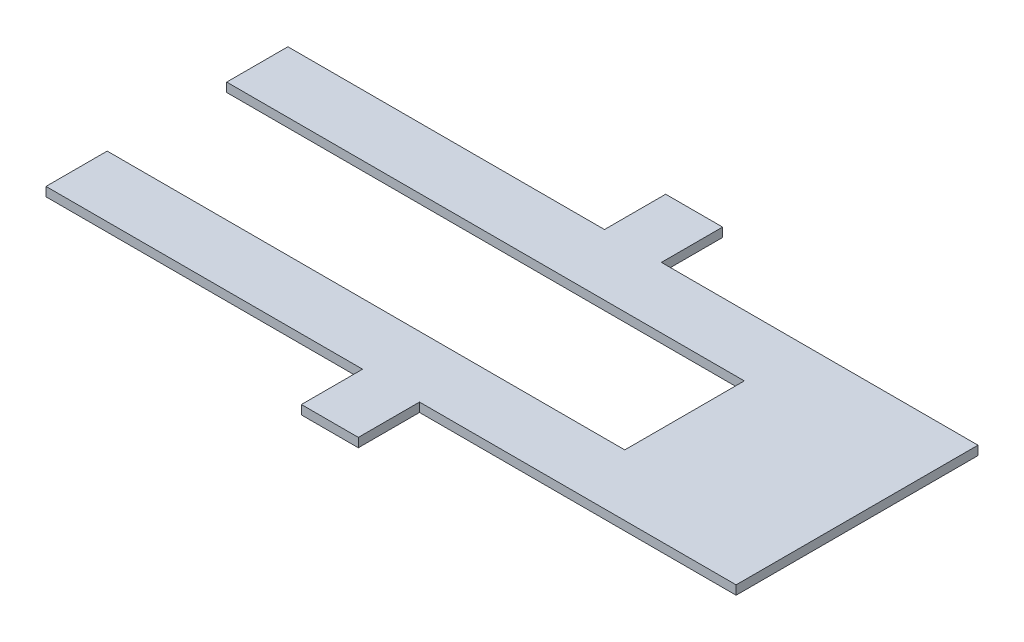
ISO-10303-21;
HEADER;
FILE_DESCRIPTION(('STEP AP214'),'2;1');
FILE_NAME('part.step','',(''),(''),'','','');
FILE_SCHEMA(('AUTOMOTIVE_DESIGN { 1 0 10303 214 1 1 1 1 }'));
ENDSEC;
DATA;
#1=APPLICATION_CONTEXT('core data for automotive mechanical design processes');
#2=APPLICATION_PROTOCOL_DEFINITION('international standard','automotive_design',2000,#1);
#3=PRODUCT_CONTEXT('',#1,'mechanical');
#4=PRODUCT('Part','Part','',(#3));
#5=PRODUCT_RELATED_PRODUCT_CATEGORY('part','',(#4));
#6=PRODUCT_DEFINITION_FORMATION('','',#4);
#7=PRODUCT_DEFINITION_CONTEXT('part definition',#1,'design');
#8=PRODUCT_DEFINITION('design','',#6,#7);
#9=PRODUCT_DEFINITION_SHAPE('','',#8);
#10=(LENGTH_UNIT() NAMED_UNIT(*) SI_UNIT(.MILLI.,.METRE.));
#11=(NAMED_UNIT(*) PLANE_ANGLE_UNIT() SI_UNIT($,.RADIAN.));
#12=(NAMED_UNIT(*) SI_UNIT($,.STERADIAN.) SOLID_ANGLE_UNIT());
#13=UNCERTAINTY_MEASURE_WITH_UNIT(LENGTH_MEASURE(1.E-05),#10,'distance_accuracy_value','');
#14=(GEOMETRIC_REPRESENTATION_CONTEXT(3) GLOBAL_UNCERTAINTY_ASSIGNED_CONTEXT((#13)) GLOBAL_UNIT_ASSIGNED_CONTEXT((#10,
#11,#12)) REPRESENTATION_CONTEXT('',''));
#15=CARTESIAN_POINT('',(0.,0.,0.));
#16=DIRECTION('',(0.,0.,1.));
#17=DIRECTION('',(1.,0.,0.));
#18=AXIS2_PLACEMENT_3D('',#15,#16,#17);
#19=CARTESIAN_POINT('',(39.8082313644022,12.7,-167.670757628808));
#20=DIRECTION('',(0.,0.,-1.));
#21=DIRECTION('',(-1.,0.,0.));
#22=AXIS2_PLACEMENT_3D('',#19,#20,#21);
#23=PLANE('',#22);
#24=DIRECTION('',(1.,0.,0.));
#25=VECTOR('',#24,1.);
#26=CARTESIAN_POINT('',(39.8082313644022,0.,-167.670757628808));
#27=LINE('',#26,#25);
#28=CARTESIAN_POINT('',(39.8082313644022,0.,-167.670757628808));
#29=VERTEX_POINT('',#28);
#30=CARTESIAN_POINT('',(484.808231364402,0.,-167.670757628808));
#31=VERTEX_POINT('',#30);
#32=EDGE_CURVE('E187',#29,#31,#27,.T.);
#33=ORIENTED_EDGE('',*,*,#32,.F.);
#34=DIRECTION('',(0.,-1.,0.));
#35=VECTOR('',#34,1.);
#36=CARTESIAN_POINT('',(39.8082313644022,12.7,-167.670757628808));
#37=LINE('',#36,#35);
#38=CARTESIAN_POINT('',(39.8082313644022,12.7,-167.670757628808));
#39=VERTEX_POINT('',#38);
#40=EDGE_CURVE('E11',#39,#29,#37,.T.);
#41=ORIENTED_EDGE('',*,*,#40,.F.);
#42=DIRECTION('',(1.,0.,0.));
#43=VECTOR('',#42,1.);
#44=CARTESIAN_POINT('',(39.8082313644022,12.7,-167.670757628808));
#45=LINE('',#44,#43);
#46=CARTESIAN_POINT('',(484.808231364402,12.7,-167.670757628808));
#47=VERTEX_POINT('',#46);
#48=EDGE_CURVE('E243',#39,#47,#45,.T.);
#49=ORIENTED_EDGE('',*,*,#48,.T.);
#50=DIRECTION('',(0.,-1.,0.));
#51=VECTOR('',#50,1.);
#52=CARTESIAN_POINT('',(484.808231364402,12.7,-167.670757628808));
#53=LINE('',#52,#51);
#54=EDGE_CURVE('E42',#47,#31,#53,.T.);
#55=ORIENTED_EDGE('',*,*,#54,.T.);
#56=EDGE_LOOP('',(#33,#41,#49,#55));
#57=FACE_BOUND('',#56,.T.);
#58=ADVANCED_FACE('F39',(#57),#23,.T.);
#59=CARTESIAN_POINT('',(39.8082313644022,12.7,-253.670757628808));
#60=DIRECTION('',(1.,0.,0.));
#61=DIRECTION('',(0.,0.,-1.));
#62=AXIS2_PLACEMENT_3D('',#59,#60,#61);
#63=PLANE('',#62);
#64=DIRECTION('',(0.,0.,1.));
#65=VECTOR('',#64,1.);
#66=CARTESIAN_POINT('',(39.8082313644022,0.,-253.670757628808));
#67=LINE('',#66,#65);
#68=CARTESIAN_POINT('',(39.8082313644022,0.,-253.670757628808));
#69=VERTEX_POINT('',#68);
#70=EDGE_CURVE('E240',#69,#29,#67,.T.);
#71=ORIENTED_EDGE('',*,*,#70,.F.);
#72=DIRECTION('',(0.,-1.,0.));
#73=VECTOR('',#72,1.);
#74=CARTESIAN_POINT('',(39.8082313644022,12.7,-253.670757628808));
#75=LINE('',#74,#73);
#76=CARTESIAN_POINT('',(39.8082313644022,12.7,-253.670757628808));
#77=VERTEX_POINT('',#76);
#78=EDGE_CURVE('E49',#77,#69,#75,.T.);
#79=ORIENTED_EDGE('',*,*,#78,.F.);
#80=DIRECTION('',(0.,0.,1.));
#81=VECTOR('',#80,1.);
#82=CARTESIAN_POINT('',(39.8082313644022,12.7,-253.670757628808));
#83=LINE('',#82,#81);
#84=EDGE_CURVE('E180',#77,#39,#83,.T.);
#85=ORIENTED_EDGE('',*,*,#84,.T.);
#86=ORIENTED_EDGE('',*,*,#40,.T.);
#87=EDGE_LOOP('',(#71,#79,#85,#86));
#88=FACE_BOUND('',#87,.T.);
#89=ADVANCED_FACE('F290',(#88),#63,.T.);
#90=CARTESIAN_POINT('',(-40.1917686355978,12.7,-253.670757628808));
#91=DIRECTION('',(0.,0.,-1.));
#92=DIRECTION('',(-1.,0.,0.));
#93=AXIS2_PLACEMENT_3D('',#90,#91,#92);
#94=PLANE('',#93);
#95=DIRECTION('',(1.,0.,0.));
#96=VECTOR('',#95,1.);
#97=CARTESIAN_POINT('',(-40.1917686355978,0.,-253.670757628808));
#98=LINE('',#97,#96);
#99=CARTESIAN_POINT('',(-40.1917686355978,0.,-253.670757628808));
#100=VERTEX_POINT('',#99);
#101=EDGE_CURVE('E163',#100,#69,#98,.T.);
#102=ORIENTED_EDGE('',*,*,#101,.F.);
#103=DIRECTION('',(0.,-1.,0.));
#104=VECTOR('',#103,1.);
#105=CARTESIAN_POINT('',(-40.1917686355978,12.7,-253.670757628808));
#106=LINE('',#105,#104);
#107=CARTESIAN_POINT('',(-40.1917686355978,12.7,-253.670757628808));
#108=VERTEX_POINT('',#107);
#109=EDGE_CURVE('E157',#108,#100,#106,.T.);
#110=ORIENTED_EDGE('',*,*,#109,.F.);
#111=DIRECTION('',(1.,0.,0.));
#112=VECTOR('',#111,1.);
#113=CARTESIAN_POINT('',(-40.1917686355978,12.7,-253.670757628808));
#114=LINE('',#113,#112);
#115=EDGE_CURVE('E161',#108,#77,#114,.T.);
#116=ORIENTED_EDGE('',*,*,#115,.T.);
#117=ORIENTED_EDGE('',*,*,#78,.T.);
#118=EDGE_LOOP('',(#102,#110,#116,#117));
#119=FACE_BOUND('',#118,.T.);
#120=ADVANCED_FACE('F159',(#119),#94,.T.);
#121=CARTESIAN_POINT('',(-40.1917686355978,12.7,-253.670757628808));
#122=DIRECTION('',(1.,0.,0.));
#123=DIRECTION('',(0.,0.,-1.));
#124=AXIS2_PLACEMENT_3D('',#121,#122,#123);
#125=PLANE('',#124);
#126=DIRECTION('',(0.,0.,1.));
#127=VECTOR('',#126,1.);
#128=CARTESIAN_POINT('',(-40.1917686355978,0.,-253.670757628808));
#129=LINE('',#128,#127);
#130=CARTESIAN_POINT('',(-40.1917686355979,0.,-167.670757628808));
#131=VERTEX_POINT('',#130);
#132=EDGE_CURVE('E235',#100,#131,#129,.T.);
#133=ORIENTED_EDGE('',*,*,#132,.T.);
#134=DIRECTION('',(0.,-1.,0.));
#135=VECTOR('',#134,1.);
#136=CARTESIAN_POINT('',(-40.1917686355979,12.7,-167.670757628808));
#137=LINE('',#136,#135);
#138=CARTESIAN_POINT('',(-40.1917686355979,12.7,-167.670757628808));
#139=VERTEX_POINT('',#138);
#140=EDGE_CURVE('E168',#139,#131,#137,.T.);
#141=ORIENTED_EDGE('',*,*,#140,.F.);
#142=DIRECTION('',(0.,0.,1.));
#143=VECTOR('',#142,1.);
#144=CARTESIAN_POINT('',(-40.1917686355978,12.7,-253.670757628808));
#145=LINE('',#144,#143);
#146=EDGE_CURVE('E171',#108,#139,#145,.T.);
#147=ORIENTED_EDGE('',*,*,#146,.F.);
#148=ORIENTED_EDGE('',*,*,#109,.T.);
#149=EDGE_LOOP('',(#133,#141,#147,#148));
#150=FACE_BOUND('',#149,.T.);
#151=ADVANCED_FACE('F172',(#150),#125,.F.);
#152=CARTESIAN_POINT('',(-485.191768635598,12.7,-167.670757628808));
#153=DIRECTION('',(0.,0.,-1.));
#154=DIRECTION('',(-1.,0.,0.));
#155=AXIS2_PLACEMENT_3D('',#152,#153,#154);
#156=PLANE('',#155);
#157=DIRECTION('',(1.,0.,0.));
#158=VECTOR('',#157,1.);
#159=CARTESIAN_POINT('',(-485.191768635598,0.,-167.670757628808));
#160=LINE('',#159,#158);
#161=CARTESIAN_POINT('',(-485.191768635598,0.,-167.670757628808));
#162=VERTEX_POINT('',#161);
#163=EDGE_CURVE('E231',#162,#131,#160,.T.);
#164=ORIENTED_EDGE('',*,*,#163,.F.);
#165=DIRECTION('',(0.,-1.,0.));
#166=VECTOR('',#165,1.);
#167=CARTESIAN_POINT('',(-485.191768635598,12.7,-167.670757628808));
#168=LINE('',#167,#166);
#169=CARTESIAN_POINT('',(-485.191768635598,12.7,-167.670757628808));
#170=VERTEX_POINT('',#169);
#171=EDGE_CURVE('E249',#170,#162,#168,.T.);
#172=ORIENTED_EDGE('',*,*,#171,.F.);
#173=DIRECTION('',(1.,0.,0.));
#174=VECTOR('',#173,1.);
#175=CARTESIAN_POINT('',(-485.191768635598,12.7,-167.670757628808));
#176=LINE('',#175,#174);
#177=EDGE_CURVE('E177',#170,#139,#176,.T.);
#178=ORIENTED_EDGE('',*,*,#177,.T.);
#179=ORIENTED_EDGE('',*,*,#140,.T.);
#180=EDGE_LOOP('',(#164,#172,#178,#179));
#181=FACE_BOUND('',#180,.T.);
#182=ADVANCED_FACE('F303',(#181),#156,.T.);
#183=CARTESIAN_POINT('',(-485.191768635598,12.7,-167.670757628808));
#184=DIRECTION('',(1.,0.,0.));
#185=DIRECTION('',(0.,0.,-1.));
#186=AXIS2_PLACEMENT_3D('',#183,#184,#185);
#187=PLANE('',#186);
#188=DIRECTION('',(0.,0.,1.));
#189=VECTOR('',#188,1.);
#190=CARTESIAN_POINT('',(-485.191768635598,0.,-167.670757628808));
#191=LINE('',#190,#189);
#192=CARTESIAN_POINT('',(-485.191768635598,0.,-81.6707576288078));
#193=VERTEX_POINT('',#192);
#194=EDGE_CURVE('E228',#162,#193,#191,.T.);
#195=ORIENTED_EDGE('',*,*,#194,.T.);
#196=DIRECTION('',(0.,-1.,0.));
#197=VECTOR('',#196,1.);
#198=CARTESIAN_POINT('',(-485.191768635598,12.7,-81.6707576288078));
#199=LINE('',#198,#197);
#200=CARTESIAN_POINT('',(-485.191768635598,12.7,-81.6707576288078));
#201=VERTEX_POINT('',#200);
#202=EDGE_CURVE('E252',#201,#193,#199,.T.);
#203=ORIENTED_EDGE('',*,*,#202,.F.);
#204=DIRECTION('',(0.,0.,1.));
#205=VECTOR('',#204,1.);
#206=CARTESIAN_POINT('',(-485.191768635598,12.7,-167.670757628808));
#207=LINE('',#206,#205);
#208=EDGE_CURVE('E489',#170,#201,#207,.T.);
#209=ORIENTED_EDGE('',*,*,#208,.F.);
#210=ORIENTED_EDGE('',*,*,#171,.T.);
#211=EDGE_LOOP('',(#195,#203,#209,#210));
#212=FACE_BOUND('',#211,.T.);
#213=ADVANCED_FACE('F306',(#212),#187,.F.);
#214=CARTESIAN_POINT('',(-485.191768635598,12.7,-81.6707576288078));
#215=DIRECTION('',(0.,0.,-1.));
#216=DIRECTION('',(-1.,0.,0.));
#217=AXIS2_PLACEMENT_3D('',#214,#215,#216);
#218=PLANE('',#217);
#219=DIRECTION('',(1.,0.,0.));
#220=VECTOR('',#219,1.);
#221=CARTESIAN_POINT('',(-485.191768635598,0.,-81.6707576288078));
#222=LINE('',#221,#220);
#223=CARTESIAN_POINT('',(242.308231364402,0.,-81.6707576288078));
#224=VERTEX_POINT('',#223);
#225=EDGE_CURVE('E225',#193,#224,#222,.T.);
#226=ORIENTED_EDGE('',*,*,#225,.T.);
#227=DIRECTION('',(0.,-1.,0.));
#228=VECTOR('',#227,1.);
#229=CARTESIAN_POINT('',(242.308231364402,12.7,-81.6707576288078));
#230=LINE('',#229,#228);
#231=CARTESIAN_POINT('',(242.308231364402,12.7,-81.6707576288078));
#232=VERTEX_POINT('',#231);
#233=EDGE_CURVE('E256',#232,#224,#230,.T.);
#234=ORIENTED_EDGE('',*,*,#233,.F.);
#235=DIRECTION('',(1.,0.,0.));
#236=VECTOR('',#235,1.);
#237=CARTESIAN_POINT('',(-485.191768635598,12.7,-81.6707576288078));
#238=LINE('',#237,#236);
#239=EDGE_CURVE('E486',#201,#232,#238,.T.);
#240=ORIENTED_EDGE('',*,*,#239,.F.);
#241=ORIENTED_EDGE('',*,*,#202,.T.);
#242=EDGE_LOOP('',(#226,#234,#240,#241));
#243=FACE_BOUND('',#242,.T.);
#244=ADVANCED_FACE('F310',(#243),#218,.F.);
#245=CARTESIAN_POINT('',(242.308231364402,12.7,-81.6707576288078));
#246=DIRECTION('',(1.,0.,0.));
#247=DIRECTION('',(0.,0.,-1.));
#248=AXIS2_PLACEMENT_3D('',#245,#246,#247);
#249=PLANE('',#248);
#250=DIRECTION('',(0.,0.,1.));
#251=VECTOR('',#250,1.);
#252=CARTESIAN_POINT('',(242.308231364402,0.,-81.6707576288078));
#253=LINE('',#252,#251);
#254=CARTESIAN_POINT('',(242.308231364402,0.,86.329242371192));
#255=VERTEX_POINT('',#254);
#256=EDGE_CURVE('E221',#224,#255,#253,.T.);
#257=ORIENTED_EDGE('',*,*,#256,.T.);
#258=DIRECTION('',(0.,-1.,0.));
#259=VECTOR('',#258,1.);
#260=CARTESIAN_POINT('',(242.308231364402,12.7,86.329242371192));
#261=LINE('',#260,#259);
#262=CARTESIAN_POINT('',(242.308231364402,12.7,86.329242371192));
#263=VERTEX_POINT('',#262);
#264=EDGE_CURVE('E260',#263,#255,#261,.T.);
#265=ORIENTED_EDGE('',*,*,#264,.F.);
#266=DIRECTION('',(0.,0.,1.));
#267=VECTOR('',#266,1.);
#268=CARTESIAN_POINT('',(242.308231364402,12.7,-81.6707576288078));
#269=LINE('',#268,#267);
#270=EDGE_CURVE('E484',#232,#263,#269,.T.);
#271=ORIENTED_EDGE('',*,*,#270,.F.);
#272=ORIENTED_EDGE('',*,*,#233,.T.);
#273=EDGE_LOOP('',(#257,#265,#271,#272));
#274=FACE_BOUND('',#273,.T.);
#275=ADVANCED_FACE('F314',(#274),#249,.F.);
#276=CARTESIAN_POINT('',(-485.191768635598,12.7,86.3292423711921));
#277=DIRECTION('',(0.,0.,-1.));
#278=DIRECTION('',(-1.,0.,0.));
#279=AXIS2_PLACEMENT_3D('',#276,#277,#278);
#280=PLANE('',#279);
#281=DIRECTION('',(1.,0.,0.));
#282=VECTOR('',#281,1.);
#283=CARTESIAN_POINT('',(-485.191768635598,0.,86.3292423711921));
#284=LINE('',#283,#282);
#285=CARTESIAN_POINT('',(-485.191768635598,0.,86.3292423711921));
#286=VERTEX_POINT('',#285);
#287=EDGE_CURVE('E217',#286,#255,#284,.T.);
#288=ORIENTED_EDGE('',*,*,#287,.F.);
#289=DIRECTION('',(0.,-1.,0.));
#290=VECTOR('',#289,1.);
#291=CARTESIAN_POINT('',(-485.191768635598,12.7,86.3292423711921));
#292=LINE('',#291,#290);
#293=CARTESIAN_POINT('',(-485.191768635598,12.7,86.3292423711921));
#294=VERTEX_POINT('',#293);
#295=EDGE_CURVE('E263',#294,#286,#292,.T.);
#296=ORIENTED_EDGE('',*,*,#295,.F.);
#297=DIRECTION('',(1.,0.,0.));
#298=VECTOR('',#297,1.);
#299=CARTESIAN_POINT('',(-485.191768635598,12.7,86.3292423711921));
#300=LINE('',#299,#298);
#301=EDGE_CURVE('E499',#294,#263,#300,.T.);
#302=ORIENTED_EDGE('',*,*,#301,.T.);
#303=ORIENTED_EDGE('',*,*,#264,.T.);
#304=EDGE_LOOP('',(#288,#296,#302,#303));
#305=FACE_BOUND('',#304,.T.);
#306=ADVANCED_FACE('F318',(#305),#280,.T.);
#307=CARTESIAN_POINT('',(-485.191768635598,12.7,172.329242371192));
#308=DIRECTION('',(-1.,0.,0.));
#309=DIRECTION('',(0.,0.,1.));
#310=AXIS2_PLACEMENT_3D('',#307,#308,#309);
#311=PLANE('',#310);
#312=DIRECTION('',(0.,0.,-1.));
#313=VECTOR('',#312,1.);
#314=CARTESIAN_POINT('',(-485.191768635598,0.,172.329242371192));
#315=LINE('',#314,#313);
#316=CARTESIAN_POINT('',(-485.191768635598,0.,172.329242371192));
#317=VERTEX_POINT('',#316);
#318=EDGE_CURVE('E213',#317,#286,#315,.T.);
#319=ORIENTED_EDGE('',*,*,#318,.F.);
#320=DIRECTION('',(0.,-1.,0.));
#321=VECTOR('',#320,1.);
#322=CARTESIAN_POINT('',(-485.191768635598,12.7,172.329242371192));
#323=LINE('',#322,#321);
#324=CARTESIAN_POINT('',(-485.191768635598,12.7,172.329242371192));
#325=VERTEX_POINT('',#324);
#326=EDGE_CURVE('E266',#325,#317,#323,.T.);
#327=ORIENTED_EDGE('',*,*,#326,.F.);
#328=DIRECTION('',(0.,0.,-1.));
#329=VECTOR('',#328,1.);
#330=CARTESIAN_POINT('',(-485.191768635598,12.7,172.329242371192));
#331=LINE('',#330,#329);
#332=EDGE_CURVE('E475',#325,#294,#331,.T.);
#333=ORIENTED_EDGE('',*,*,#332,.T.);
#334=ORIENTED_EDGE('',*,*,#295,.T.);
#335=EDGE_LOOP('',(#319,#327,#333,#334));
#336=FACE_BOUND('',#335,.T.);
#337=ADVANCED_FACE('F322',(#336),#311,.T.);
#338=CARTESIAN_POINT('',(-485.191768635598,12.7,172.329242371192));
#339=DIRECTION('',(0.,0.,-1.));
#340=DIRECTION('',(-1.,0.,0.));
#341=AXIS2_PLACEMENT_3D('',#338,#339,#340);
#342=PLANE('',#341);
#343=DIRECTION('',(1.,0.,0.));
#344=VECTOR('',#343,1.);
#345=CARTESIAN_POINT('',(-485.191768635598,0.,172.329242371192));
#346=LINE('',#345,#344);
#347=CARTESIAN_POINT('',(-40.1917686355974,0.,172.329242371192));
#348=VERTEX_POINT('',#347);
#349=EDGE_CURVE('E209',#317,#348,#346,.T.);
#350=ORIENTED_EDGE('',*,*,#349,.T.);
#351=DIRECTION('',(0.,-1.,0.));
#352=VECTOR('',#351,1.);
#353=CARTESIAN_POINT('',(-40.1917686355974,12.7,172.329242371192));
#354=LINE('',#353,#352);
#355=CARTESIAN_POINT('',(-40.1917686355974,12.7,172.329242371192));
#356=VERTEX_POINT('',#355);
#357=EDGE_CURVE('E269',#356,#348,#354,.T.);
#358=ORIENTED_EDGE('',*,*,#357,.F.);
#359=DIRECTION('',(1.,0.,0.));
#360=VECTOR('',#359,1.);
#361=CARTESIAN_POINT('',(-485.191768635598,12.7,172.329242371192));
#362=LINE('',#361,#360);
#363=EDGE_CURVE('E504',#325,#356,#362,.T.);
#364=ORIENTED_EDGE('',*,*,#363,.F.);
#365=ORIENTED_EDGE('',*,*,#326,.T.);
#366=EDGE_LOOP('',(#350,#358,#364,#365));
#367=FACE_BOUND('',#366,.T.);
#368=ADVANCED_FACE('F326',(#367),#342,.F.);
#369=CARTESIAN_POINT('',(-40.1917686355974,12.7,258.329242371192));
#370=DIRECTION('',(-1.,0.,0.));
#371=DIRECTION('',(0.,0.,1.));
#372=AXIS2_PLACEMENT_3D('',#369,#370,#371);
#373=PLANE('',#372);
#374=DIRECTION('',(0.,0.,-1.));
#375=VECTOR('',#374,1.);
#376=CARTESIAN_POINT('',(-40.1917686355974,0.,258.329242371192));
#377=LINE('',#376,#375);
#378=CARTESIAN_POINT('',(-40.1917686355974,0.,258.329242371192));
#379=VERTEX_POINT('',#378);
#380=EDGE_CURVE('E205',#379,#348,#377,.T.);
#381=ORIENTED_EDGE('',*,*,#380,.F.);
#382=DIRECTION('',(0.,-1.,0.));
#383=VECTOR('',#382,1.);
#384=CARTESIAN_POINT('',(-40.1917686355974,12.7,258.329242371192));
#385=LINE('',#384,#383);
#386=CARTESIAN_POINT('',(-40.1917686355974,12.7,258.329242371192));
#387=VERTEX_POINT('',#386);
#388=EDGE_CURVE('E272',#387,#379,#385,.T.);
#389=ORIENTED_EDGE('',*,*,#388,.F.);
#390=DIRECTION('',(0.,0.,-1.));
#391=VECTOR('',#390,1.);
#392=CARTESIAN_POINT('',(-40.1917686355974,12.7,258.329242371192));
#393=LINE('',#392,#391);
#394=EDGE_CURVE('E467',#387,#356,#393,.T.);
#395=ORIENTED_EDGE('',*,*,#394,.T.);
#396=ORIENTED_EDGE('',*,*,#357,.T.);
#397=EDGE_LOOP('',(#381,#389,#395,#396));
#398=FACE_BOUND('',#397,.T.);
#399=ADVANCED_FACE('F330',(#398),#373,.T.);
#400=CARTESIAN_POINT('',(-40.1917686355974,12.7,258.329242371192));
#401=DIRECTION('',(0.,0.,-1.));
#402=DIRECTION('',(-1.,0.,0.));
#403=AXIS2_PLACEMENT_3D('',#400,#401,#402);
#404=PLANE('',#403);
#405=DIRECTION('',(1.,0.,0.));
#406=VECTOR('',#405,1.);
#407=CARTESIAN_POINT('',(-40.1917686355974,0.,258.329242371192));
#408=LINE('',#407,#406);
#409=CARTESIAN_POINT('',(39.8082313644024,0.,258.329242371192));
#410=VERTEX_POINT('',#409);
#411=EDGE_CURVE('E202',#379,#410,#408,.T.);
#412=ORIENTED_EDGE('',*,*,#411,.T.);
#413=DIRECTION('',(0.,-1.,0.));
#414=VECTOR('',#413,1.);
#415=CARTESIAN_POINT('',(39.8082313644024,12.7,258.329242371192));
#416=LINE('',#415,#414);
#417=CARTESIAN_POINT('',(39.8082313644024,12.7,258.329242371192));
#418=VERTEX_POINT('',#417);
#419=EDGE_CURVE('E275',#418,#410,#416,.T.);
#420=ORIENTED_EDGE('',*,*,#419,.F.);
#421=DIRECTION('',(1.,0.,0.));
#422=VECTOR('',#421,1.);
#423=CARTESIAN_POINT('',(-40.1917686355974,12.7,258.329242371192));
#424=LINE('',#423,#422);
#425=EDGE_CURVE('E464',#387,#418,#424,.T.);
#426=ORIENTED_EDGE('',*,*,#425,.F.);
#427=ORIENTED_EDGE('',*,*,#388,.T.);
#428=EDGE_LOOP('',(#412,#420,#426,#427));
#429=FACE_BOUND('',#428,.T.);
#430=ADVANCED_FACE('F334',(#429),#404,.F.);
#431=CARTESIAN_POINT('',(39.8082313644024,12.7,258.329242371192));
#432=DIRECTION('',(-1.,0.,0.));
#433=DIRECTION('',(0.,0.,1.));
#434=AXIS2_PLACEMENT_3D('',#431,#432,#433);
#435=PLANE('',#434);
#436=DIRECTION('',(0.,0.,-1.));
#437=VECTOR('',#436,1.);
#438=CARTESIAN_POINT('',(39.8082313644024,0.,258.329242371192));
#439=LINE('',#438,#437);
#440=CARTESIAN_POINT('',(39.8082313644024,0.,172.329242371192));
#441=VERTEX_POINT('',#440);
#442=EDGE_CURVE('E199',#410,#441,#439,.T.);
#443=ORIENTED_EDGE('',*,*,#442,.T.);
#444=DIRECTION('',(0.,-1.,0.));
#445=VECTOR('',#444,1.);
#446=CARTESIAN_POINT('',(39.8082313644024,12.7,172.329242371192));
#447=LINE('',#446,#445);
#448=CARTESIAN_POINT('',(39.8082313644024,12.7,172.329242371192));
#449=VERTEX_POINT('',#448);
#450=EDGE_CURVE('E279',#449,#441,#447,.T.);
#451=ORIENTED_EDGE('',*,*,#450,.F.);
#452=DIRECTION('',(0.,0.,-1.));
#453=VECTOR('',#452,1.);
#454=CARTESIAN_POINT('',(39.8082313644024,12.7,258.329242371192));
#455=LINE('',#454,#453);
#456=EDGE_CURVE('E462',#418,#449,#455,.T.);
#457=ORIENTED_EDGE('',*,*,#456,.F.);
#458=ORIENTED_EDGE('',*,*,#419,.T.);
#459=EDGE_LOOP('',(#443,#451,#457,#458));
#460=FACE_BOUND('',#459,.T.);
#461=ADVANCED_FACE('F338',(#460),#435,.F.);
#462=CARTESIAN_POINT('',(39.8082313644024,12.7,172.329242371192));
#463=DIRECTION('',(0.,0.,-1.));
#464=DIRECTION('',(-1.,0.,0.));
#465=AXIS2_PLACEMENT_3D('',#462,#463,#464);
#466=PLANE('',#465);
#467=DIRECTION('',(1.,0.,0.));
#468=VECTOR('',#467,1.);
#469=CARTESIAN_POINT('',(39.8082313644024,0.,172.329242371192));
#470=LINE('',#469,#468);
#471=CARTESIAN_POINT('',(484.808231364402,0.,172.329242371192));
#472=VERTEX_POINT('',#471);
#473=EDGE_CURVE('E195',#441,#472,#470,.T.);
#474=ORIENTED_EDGE('',*,*,#473,.T.);
#475=DIRECTION('',(0.,-1.,0.));
#476=VECTOR('',#475,1.);
#477=CARTESIAN_POINT('',(484.808231364402,12.7,172.329242371192));
#478=LINE('',#477,#476);
#479=CARTESIAN_POINT('',(484.808231364402,12.7,172.329242371192));
#480=VERTEX_POINT('',#479);
#481=EDGE_CURVE('E282',#480,#472,#478,.T.);
#482=ORIENTED_EDGE('',*,*,#481,.F.);
#483=DIRECTION('',(1.,0.,0.));
#484=VECTOR('',#483,1.);
#485=CARTESIAN_POINT('',(39.8082313644024,12.7,172.329242371192));
#486=LINE('',#485,#484);
#487=EDGE_CURVE('E513',#449,#480,#486,.T.);
#488=ORIENTED_EDGE('',*,*,#487,.F.);
#489=ORIENTED_EDGE('',*,*,#450,.T.);
#490=EDGE_LOOP('',(#474,#482,#488,#489));
#491=FACE_BOUND('',#490,.T.);
#492=ADVANCED_FACE('F342',(#491),#466,.F.);
#493=CARTESIAN_POINT('',(484.808231364402,12.7,-167.670757628808));
#494=DIRECTION('',(1.,0.,0.));
#495=DIRECTION('',(0.,0.,-1.));
#496=AXIS2_PLACEMENT_3D('',#493,#494,#495);
#497=PLANE('',#496);
#498=DIRECTION('',(0.,0.,1.));
#499=VECTOR('',#498,1.);
#500=CARTESIAN_POINT('',(484.808231364402,0.,-167.670757628808));
#501=LINE('',#500,#499);
#502=EDGE_CURVE('E191',#31,#472,#501,.T.);
#503=ORIENTED_EDGE('',*,*,#502,.F.);
#504=ORIENTED_EDGE('',*,*,#54,.F.);
#505=DIRECTION('',(0.,0.,1.));
#506=VECTOR('',#505,1.);
#507=CARTESIAN_POINT('',(484.808231364402,12.7,-167.670757628808));
#508=LINE('',#507,#506);
#509=EDGE_CURVE('E516',#47,#480,#508,.T.);
#510=ORIENTED_EDGE('',*,*,#509,.T.);
#511=ORIENTED_EDGE('',*,*,#481,.T.);
#512=EDGE_LOOP('',(#503,#504,#510,#511));
#513=FACE_BOUND('',#512,.T.);
#514=ADVANCED_FACE('F286',(#513),#497,.T.);
#515=CARTESIAN_POINT('',(0.,12.7,0.));
#516=DIRECTION('',(0.,-1.,0.));
#517=DIRECTION('',(0.,0.,-1.));
#518=AXIS2_PLACEMENT_3D('',#515,#516,#517);
#519=PLANE('',#518);
#520=ORIENTED_EDGE('',*,*,#48,.F.);
#521=ORIENTED_EDGE('',*,*,#84,.F.);
#522=ORIENTED_EDGE('',*,*,#115,.F.);
#523=ORIENTED_EDGE('',*,*,#146,.T.);
#524=ORIENTED_EDGE('',*,*,#177,.F.);
#525=ORIENTED_EDGE('',*,*,#208,.T.);
#526=ORIENTED_EDGE('',*,*,#239,.T.);
#527=ORIENTED_EDGE('',*,*,#270,.T.);
#528=ORIENTED_EDGE('',*,*,#301,.F.);
#529=ORIENTED_EDGE('',*,*,#332,.F.);
#530=ORIENTED_EDGE('',*,*,#363,.T.);
#531=ORIENTED_EDGE('',*,*,#394,.F.);
#532=ORIENTED_EDGE('',*,*,#425,.T.);
#533=ORIENTED_EDGE('',*,*,#456,.T.);
#534=ORIENTED_EDGE('',*,*,#487,.T.);
#535=ORIENTED_EDGE('',*,*,#509,.F.);
#536=EDGE_LOOP('',(#520,#521,#522,#523,#524,#525,#526,#527,#528,#529,#530,#531,#532,#533,#534,#535));
#537=FACE_BOUND('',#536,.T.);
#538=ADVANCED_FACE('F179',(#537),#519,.F.);
#539=CARTESIAN_POINT('',(0.,0.,0.));
#540=DIRECTION('',(0.,-1.,0.));
#541=DIRECTION('',(0.,0.,-1.));
#542=AXIS2_PLACEMENT_3D('',#539,#540,#541);
#543=PLANE('',#542);
#544=ORIENTED_EDGE('',*,*,#32,.T.);
#545=ORIENTED_EDGE('',*,*,#502,.T.);
#546=ORIENTED_EDGE('',*,*,#473,.F.);
#547=ORIENTED_EDGE('',*,*,#442,.F.);
#548=ORIENTED_EDGE('',*,*,#411,.F.);
#549=ORIENTED_EDGE('',*,*,#380,.T.);
#550=ORIENTED_EDGE('',*,*,#349,.F.);
#551=ORIENTED_EDGE('',*,*,#318,.T.);
#552=ORIENTED_EDGE('',*,*,#287,.T.);
#553=ORIENTED_EDGE('',*,*,#256,.F.);
#554=ORIENTED_EDGE('',*,*,#225,.F.);
#555=ORIENTED_EDGE('',*,*,#194,.F.);
#556=ORIENTED_EDGE('',*,*,#163,.T.);
#557=ORIENTED_EDGE('',*,*,#132,.F.);
#558=ORIENTED_EDGE('',*,*,#101,.T.);
#559=ORIENTED_EDGE('',*,*,#70,.T.);
#560=EDGE_LOOP('',(#544,#545,#546,#547,#548,#549,#550,#551,#552,#553,#554,#555,#556,#557,#558,#559));
#561=FACE_BOUND('',#560,.T.);
#562=ADVANCED_FACE('F289',(#561),#543,.T.);
#563=CLOSED_SHELL('',(#58,#89,#120,#151,#182,#213,#244,#275,#306,#337,#368,#399,#430,#461,#492,
#514,#538,#562));
#564=MANIFOLD_SOLID_BREP('B2',#563);
#565=ADVANCED_BREP_SHAPE_REPRESENTATION('',(#18,#564),#14);
#566=SHAPE_DEFINITION_REPRESENTATION(#9,#565);
ENDSEC;
END-ISO-10303-21;
